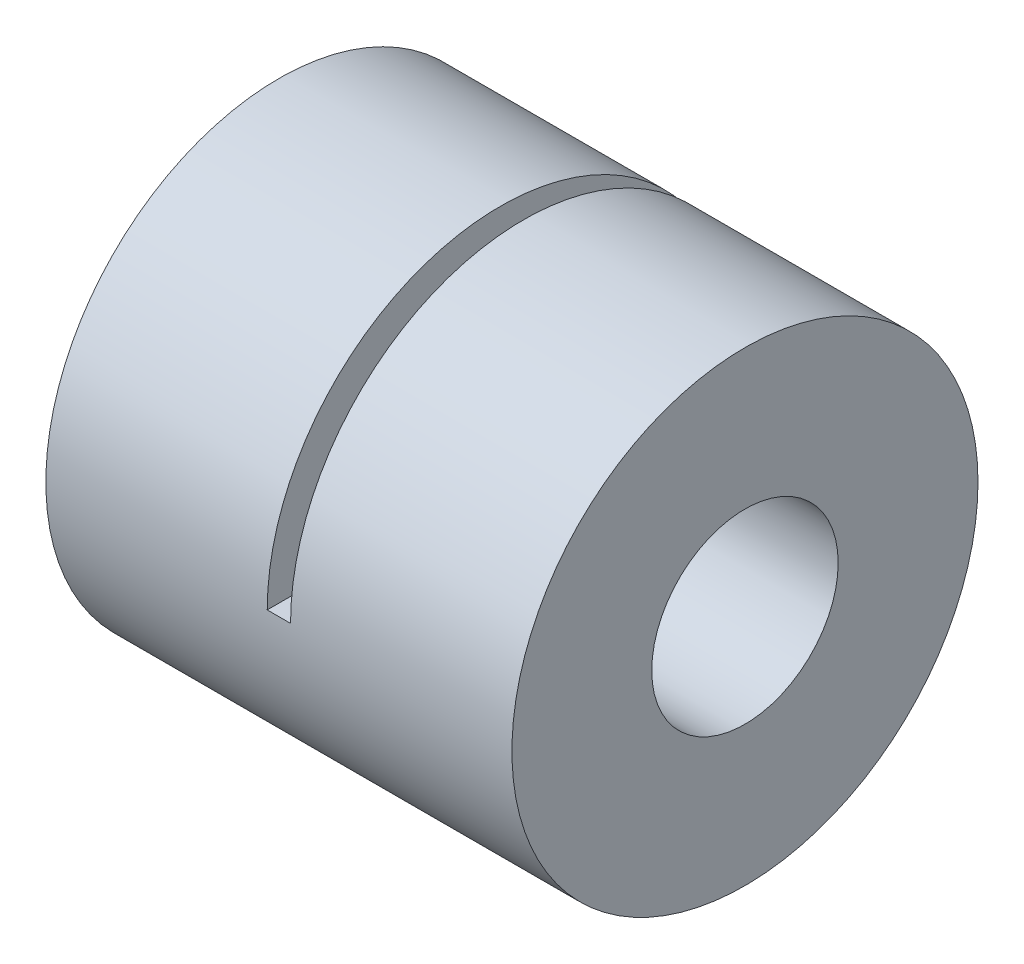
ISO-10303-21;
HEADER;
FILE_DESCRIPTION(('STEP AP214'),'2;1');
FILE_NAME('part.step','',(''),(''),'','','');
FILE_SCHEMA(('AUTOMOTIVE_DESIGN { 1 0 10303 214 1 1 1 1 }'));
ENDSEC;
DATA;
#1=APPLICATION_CONTEXT('core data for automotive mechanical design processes');
#2=APPLICATION_PROTOCOL_DEFINITION('international standard','automotive_design',2000,#1);
#3=PRODUCT_CONTEXT('',#1,'mechanical');
#4=PRODUCT('Part','Part','',(#3));
#5=PRODUCT_RELATED_PRODUCT_CATEGORY('part','',(#4));
#6=PRODUCT_DEFINITION_FORMATION('','',#4);
#7=PRODUCT_DEFINITION_CONTEXT('part definition',#1,'design');
#8=PRODUCT_DEFINITION('design','',#6,#7);
#9=PRODUCT_DEFINITION_SHAPE('','',#8);
#10=(LENGTH_UNIT() NAMED_UNIT(*) SI_UNIT(.MILLI.,.METRE.));
#11=(NAMED_UNIT(*) PLANE_ANGLE_UNIT() SI_UNIT($,.RADIAN.));
#12=(NAMED_UNIT(*) SI_UNIT($,.STERADIAN.) SOLID_ANGLE_UNIT());
#13=UNCERTAINTY_MEASURE_WITH_UNIT(LENGTH_MEASURE(1.E-05),#10,'distance_accuracy_value','');
#14=(GEOMETRIC_REPRESENTATION_CONTEXT(3) GLOBAL_UNCERTAINTY_ASSIGNED_CONTEXT((#13)) GLOBAL_UNIT_ASSIGNED_CONTEXT((#10,
#11,#12)) REPRESENTATION_CONTEXT('',''));
#15=CARTESIAN_POINT('',(0.,0.,0.));
#16=DIRECTION('',(0.,0.,1.));
#17=DIRECTION('',(1.,0.,0.));
#18=AXIS2_PLACEMENT_3D('',#15,#16,#17);
#19=CARTESIAN_POINT('',(20.,0.,0.));
#20=DIRECTION('',(-1.,0.,0.));
#21=DIRECTION('',(0.,0.,1.));
#22=AXIS2_PLACEMENT_3D('',#19,#20,#21);
#23=CYLINDRICAL_SURFACE('',#22,10.);
#24=CARTESIAN_POINT('',(20.,0.,0.));
#25=DIRECTION('',(1.,0.,0.));
#26=DIRECTION('',(0.,0.,-1.));
#27=AXIS2_PLACEMENT_3D('',#24,#25,#26);
#28=CIRCLE('',#27,10.);
#29=CARTESIAN_POINT('',(20.,0.,-10.));
#30=VERTEX_POINT('',#29);
#31=EDGE_CURVE('E103',#30,#30,#28,.T.);
#32=ORIENTED_EDGE('',*,*,#31,.F.);
#33=EDGE_LOOP('',(#32));
#34=FACE_BOUND('',#33,.T.);
#35=CARTESIAN_POINT('',(0.,0.,0.));
#36=DIRECTION('',(1.,0.,0.));
#37=DIRECTION('',(0.,0.,-1.));
#38=AXIS2_PLACEMENT_3D('',#35,#36,#37);
#39=CIRCLE('',#38,10.);
#40=CARTESIAN_POINT('',(0.,0.,-10.));
#41=VERTEX_POINT('',#40);
#42=EDGE_CURVE('E100',#41,#41,#39,.T.);
#43=ORIENTED_EDGE('',*,*,#42,.T.);
#44=EDGE_LOOP('',(#43));
#45=FACE_BOUND('',#44,.T.);
#46=CARTESIAN_POINT('',(9.5,0.,0.));
#47=DIRECTION('',(1.,0.,0.));
#48=DIRECTION('',(0.,0.,-1.));
#49=AXIS2_PLACEMENT_3D('',#46,#47,#48);
#50=CIRCLE('',#49,10.);
#51=CARTESIAN_POINT('',(9.5,0.,-10.));
#52=VERTEX_POINT('',#51);
#53=CARTESIAN_POINT('',(9.5,0.,10.));
#54=VERTEX_POINT('',#53);
#55=EDGE_CURVE('E47',#52,#54,#50,.T.);
#56=ORIENTED_EDGE('',*,*,#55,.F.);
#57=DIRECTION('',(-1.,0.,0.));
#58=VECTOR('',#57,1.);
#59=CARTESIAN_POINT('',(10.5,0.,-10.));
#60=LINE('',#59,#58);
#61=CARTESIAN_POINT('',(10.5,0.,-10.));
#62=VERTEX_POINT('',#61);
#63=EDGE_CURVE('E89',#62,#52,#60,.T.);
#64=ORIENTED_EDGE('',*,*,#63,.F.);
#65=CARTESIAN_POINT('',(10.5,0.,0.));
#66=DIRECTION('',(-1.,0.,0.));
#67=DIRECTION('',(0.,0.,1.));
#68=AXIS2_PLACEMENT_3D('',#65,#66,#67);
#69=CIRCLE('',#68,10.);
#70=CARTESIAN_POINT('',(10.5,0.,10.));
#71=VERTEX_POINT('',#70);
#72=EDGE_CURVE('E84',#71,#62,#69,.T.);
#73=ORIENTED_EDGE('',*,*,#72,.F.);
#74=DIRECTION('',(1.,0.,0.));
#75=VECTOR('',#74,1.);
#76=CARTESIAN_POINT('',(10.5,0.,10.));
#77=LINE('',#76,#75);
#78=EDGE_CURVE('E73',#54,#71,#77,.T.);
#79=ORIENTED_EDGE('',*,*,#78,.F.);
#80=EDGE_LOOP('',(#56,#64,#73,#79));
#81=FACE_BOUND('',#80,.T.);
#82=ADVANCED_FACE('F33',(#34,#45,#81),#23,.T.);
#83=CARTESIAN_POINT('',(20.,0.,0.));
#84=DIRECTION('',(-1.,0.,0.));
#85=DIRECTION('',(0.,0.,1.));
#86=AXIS2_PLACEMENT_3D('',#83,#84,#85);
#87=CYLINDRICAL_SURFACE('',#86,4.);
#88=CARTESIAN_POINT('',(20.,0.,0.));
#89=DIRECTION('',(1.,0.,0.));
#90=DIRECTION('',(0.,0.,-1.));
#91=AXIS2_PLACEMENT_3D('',#88,#89,#90);
#92=CIRCLE('',#91,4.);
#93=CARTESIAN_POINT('',(20.,0.,-4.));
#94=VERTEX_POINT('',#93);
#95=EDGE_CURVE('E97',#94,#94,#92,.T.);
#96=ORIENTED_EDGE('',*,*,#95,.T.);
#97=EDGE_LOOP('',(#96));
#98=FACE_BOUND('',#97,.T.);
#99=CARTESIAN_POINT('',(0.,0.,0.));
#100=DIRECTION('',(1.,0.,0.));
#101=DIRECTION('',(0.,0.,-1.));
#102=AXIS2_PLACEMENT_3D('',#99,#100,#101);
#103=CIRCLE('',#102,4.);
#104=CARTESIAN_POINT('',(0.,0.,-4.));
#105=VERTEX_POINT('',#104);
#106=EDGE_CURVE('E93',#105,#105,#103,.T.);
#107=ORIENTED_EDGE('',*,*,#106,.F.);
#108=EDGE_LOOP('',(#107));
#109=FACE_BOUND('',#108,.T.);
#110=CARTESIAN_POINT('',(10.5,0.,0.));
#111=DIRECTION('',(-1.,0.,0.));
#112=DIRECTION('',(0.,0.,1.));
#113=AXIS2_PLACEMENT_3D('',#110,#111,#112);
#114=CIRCLE('',#113,4.);
#115=CARTESIAN_POINT('',(10.5,0.,4.));
#116=VERTEX_POINT('',#115);
#117=CARTESIAN_POINT('',(10.5,0.,-4.));
#118=VERTEX_POINT('',#117);
#119=EDGE_CURVE('E87',#116,#118,#114,.T.);
#120=ORIENTED_EDGE('',*,*,#119,.T.);
#121=DIRECTION('',(-1.,0.,0.));
#122=VECTOR('',#121,1.);
#123=CARTESIAN_POINT('',(20.,0.,-4.));
#124=LINE('',#123,#122);
#125=CARTESIAN_POINT('',(9.5,0.,-4.));
#126=VERTEX_POINT('',#125);
#127=EDGE_CURVE('E11',#118,#126,#124,.T.);
#128=ORIENTED_EDGE('',*,*,#127,.T.);
#129=CARTESIAN_POINT('',(9.5,0.,0.));
#130=DIRECTION('',(1.,0.,0.));
#131=DIRECTION('',(0.,0.,-1.));
#132=AXIS2_PLACEMENT_3D('',#129,#130,#131);
#133=CIRCLE('',#132,4.);
#134=CARTESIAN_POINT('',(9.5,0.,4.));
#135=VERTEX_POINT('',#134);
#136=EDGE_CURVE('E40',#126,#135,#133,.T.);
#137=ORIENTED_EDGE('',*,*,#136,.T.);
#138=DIRECTION('',(-1.,0.,0.));
#139=VECTOR('',#138,1.);
#140=CARTESIAN_POINT('',(20.,0.,4.));
#141=LINE('',#140,#139);
#142=EDGE_CURVE('E106',#135,#116,#141,.F.);
#143=ORIENTED_EDGE('',*,*,#142,.T.);
#144=EDGE_LOOP('',(#120,#128,#137,#143));
#145=FACE_BOUND('',#144,.T.);
#146=ADVANCED_FACE('F112',(#98,#109,#145),#87,.F.);
#147=CARTESIAN_POINT('',(20.,0.,0.));
#148=DIRECTION('',(1.,0.,0.));
#149=DIRECTION('',(0.,0.,-1.));
#150=AXIS2_PLACEMENT_3D('',#147,#148,#149);
#151=PLANE('',#150);
#152=ORIENTED_EDGE('',*,*,#31,.T.);
#153=EDGE_LOOP('',(#152));
#154=FACE_BOUND('',#153,.T.);
#155=ORIENTED_EDGE('',*,*,#95,.F.);
#156=EDGE_LOOP('',(#155));
#157=FACE_BOUND('',#156,.T.);
#158=ADVANCED_FACE('F130',(#154,#157),#151,.T.);
#159=CARTESIAN_POINT('',(0.,0.,0.));
#160=DIRECTION('',(1.,0.,0.));
#161=DIRECTION('',(0.,0.,-1.));
#162=AXIS2_PLACEMENT_3D('',#159,#160,#161);
#163=PLANE('',#162);
#164=ORIENTED_EDGE('',*,*,#42,.F.);
#165=EDGE_LOOP('',(#164));
#166=FACE_BOUND('',#165,.T.);
#167=ORIENTED_EDGE('',*,*,#106,.T.);
#168=EDGE_LOOP('',(#167));
#169=FACE_BOUND('',#168,.T.);
#170=ADVANCED_FACE('F137',(#166,#169),#163,.F.);
#171=CARTESIAN_POINT('',(9.5,10.,10.));
#172=DIRECTION('',(1.,0.,0.));
#173=DIRECTION('',(0.,0.,-1.));
#174=AXIS2_PLACEMENT_3D('',#171,#172,#173);
#175=PLANE('',#174);
#176=ORIENTED_EDGE('',*,*,#55,.T.);
#177=DIRECTION('',(0.,0.,1.));
#178=VECTOR('',#177,1.);
#179=CARTESIAN_POINT('',(9.5,0.,10.));
#180=LINE('',#179,#178);
#181=EDGE_CURVE('E75',#135,#54,#180,.T.);
#182=ORIENTED_EDGE('',*,*,#181,.F.);
#183=ORIENTED_EDGE('',*,*,#136,.F.);
#184=EDGE_CURVE('E79',#52,#126,#180,.T.);
#185=ORIENTED_EDGE('',*,*,#184,.F.);
#186=EDGE_LOOP('',(#176,#182,#183,#185));
#187=FACE_BOUND('',#186,.T.);
#188=ADVANCED_FACE('F114',(#187),#175,.T.);
#189=CARTESIAN_POINT('',(10.5,10.,10.));
#190=DIRECTION('',(-1.,0.,0.));
#191=DIRECTION('',(0.,0.,1.));
#192=AXIS2_PLACEMENT_3D('',#189,#190,#191);
#193=PLANE('',#192);
#194=ORIENTED_EDGE('',*,*,#72,.T.);
#195=DIRECTION('',(0.,0.,-1.));
#196=VECTOR('',#195,1.);
#197=CARTESIAN_POINT('',(10.5,0.,10.));
#198=LINE('',#197,#196);
#199=EDGE_CURVE('E78',#118,#62,#198,.T.);
#200=ORIENTED_EDGE('',*,*,#199,.F.);
#201=ORIENTED_EDGE('',*,*,#119,.F.);
#202=EDGE_CURVE('E55',#71,#116,#198,.T.);
#203=ORIENTED_EDGE('',*,*,#202,.F.);
#204=EDGE_LOOP('',(#194,#200,#201,#203));
#205=FACE_BOUND('',#204,.T.);
#206=ADVANCED_FACE('F82',(#205),#193,.T.);
#207=CARTESIAN_POINT('',(0.,0.,0.));
#208=DIRECTION('',(0.,1.,0.));
#209=DIRECTION('',(0.,0.,1.));
#210=AXIS2_PLACEMENT_3D('',#207,#208,#209);
#211=PLANE('',#210);
#212=ORIENTED_EDGE('',*,*,#199,.T.);
#213=ORIENTED_EDGE('',*,*,#63,.T.);
#214=ORIENTED_EDGE('',*,*,#184,.T.);
#215=ORIENTED_EDGE('',*,*,#127,.F.);
#216=EDGE_LOOP('',(#212,#213,#214,#215));
#217=FACE_BOUND('',#216,.T.);
#218=ADVANCED_FACE('F116',(#217),#211,.T.);
#219=ORIENTED_EDGE('',*,*,#181,.T.);
#220=ORIENTED_EDGE('',*,*,#78,.T.);
#221=ORIENTED_EDGE('',*,*,#202,.T.);
#222=ORIENTED_EDGE('',*,*,#142,.F.);
#223=EDGE_LOOP('',(#219,#220,#221,#222));
#224=FACE_BOUND('',#223,.T.);
#225=ADVANCED_FACE('F74',(#224),#211,.T.);
#226=CLOSED_SHELL('',(#82,#146,#158,#170,#188,#206,#218,#225));
#227=MANIFOLD_SOLID_BREP('B2',#226);
#228=ADVANCED_BREP_SHAPE_REPRESENTATION('',(#18,#227),#14);
#229=SHAPE_DEFINITION_REPRESENTATION(#9,#228);
ENDSEC;
END-ISO-10303-21;
